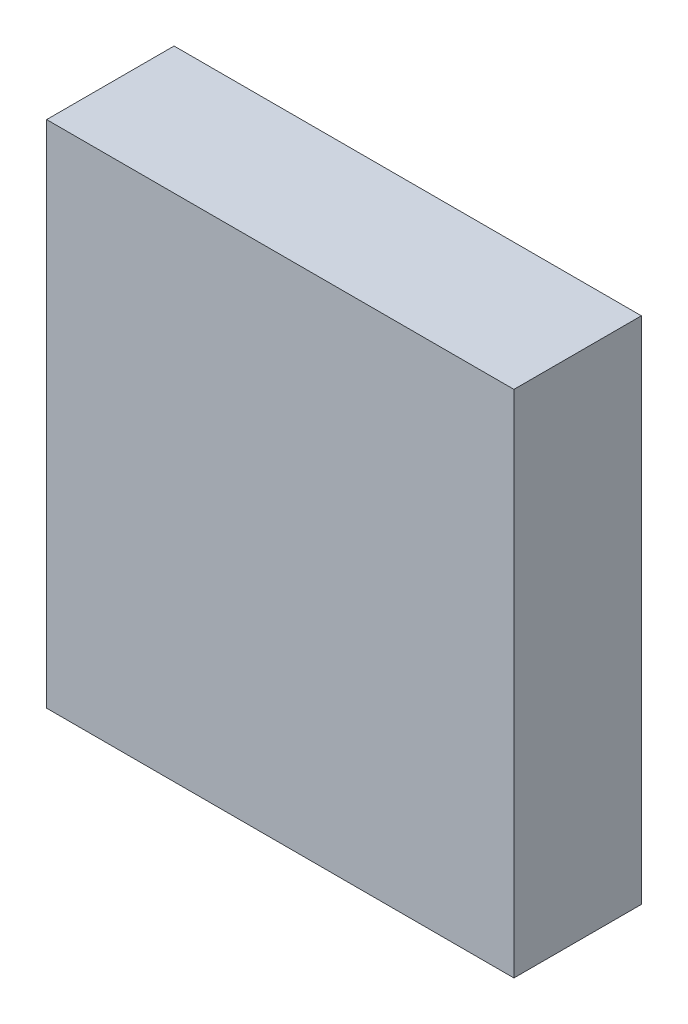
ISO-10303-21;
HEADER;
FILE_DESCRIPTION(('STEP AP214'),'2;1');
FILE_NAME('part.step','',(''),(''),'','','');
FILE_SCHEMA(('AUTOMOTIVE_DESIGN { 1 0 10303 214 1 1 1 1 }'));
ENDSEC;
DATA;
#1=APPLICATION_CONTEXT('core data for automotive mechanical design processes');
#2=APPLICATION_PROTOCOL_DEFINITION('international standard','automotive_design',2000,#1);
#3=PRODUCT_CONTEXT('',#1,'mechanical');
#4=PRODUCT('Part','Part','',(#3));
#5=PRODUCT_RELATED_PRODUCT_CATEGORY('part','',(#4));
#6=PRODUCT_DEFINITION_FORMATION('','',#4);
#7=PRODUCT_DEFINITION_CONTEXT('part definition',#1,'design');
#8=PRODUCT_DEFINITION('design','',#6,#7);
#9=PRODUCT_DEFINITION_SHAPE('','',#8);
#10=(LENGTH_UNIT() NAMED_UNIT(*) SI_UNIT(.MILLI.,.METRE.));
#11=(NAMED_UNIT(*) PLANE_ANGLE_UNIT() SI_UNIT($,.RADIAN.));
#12=(NAMED_UNIT(*) SI_UNIT($,.STERADIAN.) SOLID_ANGLE_UNIT());
#13=UNCERTAINTY_MEASURE_WITH_UNIT(LENGTH_MEASURE(1.E-05),#10,'distance_accuracy_value','');
#14=(GEOMETRIC_REPRESENTATION_CONTEXT(3) GLOBAL_UNCERTAINTY_ASSIGNED_CONTEXT((#13)) GLOBAL_UNIT_ASSIGNED_CONTEXT((#10,
#11,#12)) REPRESENTATION_CONTEXT('',''));
#15=CARTESIAN_POINT('',(0.,0.,0.));
#16=DIRECTION('',(0.,0.,1.));
#17=DIRECTION('',(1.,0.,0.));
#18=AXIS2_PLACEMENT_3D('',#15,#16,#17);
#19=CARTESIAN_POINT('',(5.5,-6.,3.));
#20=DIRECTION('',(-1.,0.,0.));
#21=DIRECTION('',(0.,0.,1.));
#22=AXIS2_PLACEMENT_3D('',#19,#20,#21);
#23=PLANE('',#22);
#24=DIRECTION('',(0.,1.,0.));
#25=VECTOR('',#24,1.);
#26=CARTESIAN_POINT('',(5.5,-6.,0.));
#27=LINE('',#26,#25);
#28=CARTESIAN_POINT('',(5.5,-6.,0.));
#29=VERTEX_POINT('',#28);
#30=CARTESIAN_POINT('',(5.5,6.,0.));
#31=VERTEX_POINT('',#30);
#32=EDGE_CURVE('E113',#29,#31,#27,.T.);
#33=ORIENTED_EDGE('',*,*,#32,.T.);
#34=DIRECTION('',(0.,0.,-1.));
#35=VECTOR('',#34,1.);
#36=CARTESIAN_POINT('',(5.5,6.,3.));
#37=LINE('',#36,#35);
#38=CARTESIAN_POINT('',(5.5,6.,3.));
#39=VERTEX_POINT('',#38);
#40=EDGE_CURVE('E11',#39,#31,#37,.T.);
#41=ORIENTED_EDGE('',*,*,#40,.F.);
#42=DIRECTION('',(0.,1.,0.));
#43=VECTOR('',#42,1.);
#44=CARTESIAN_POINT('',(5.5,-6.,3.));
#45=LINE('',#44,#43);
#46=CARTESIAN_POINT('',(5.5,-6.,3.));
#47=VERTEX_POINT('',#46);
#48=EDGE_CURVE('E97',#47,#39,#45,.T.);
#49=ORIENTED_EDGE('',*,*,#48,.F.);
#50=DIRECTION('',(0.,0.,-1.));
#51=VECTOR('',#50,1.);
#52=CARTESIAN_POINT('',(5.5,-6.,3.));
#53=LINE('',#52,#51);
#54=EDGE_CURVE('E109',#47,#29,#53,.T.);
#55=ORIENTED_EDGE('',*,*,#54,.T.);
#56=EDGE_LOOP('',(#33,#41,#49,#55));
#57=FACE_BOUND('',#56,.T.);
#58=ADVANCED_FACE('F45',(#57),#23,.F.);
#59=CARTESIAN_POINT('',(-5.5,6.,3.));
#60=DIRECTION('',(0.,-1.,0.));
#61=DIRECTION('',(0.,0.,-1.));
#62=AXIS2_PLACEMENT_3D('',#59,#60,#61);
#63=PLANE('',#62);
#64=DIRECTION('',(-1.,0.,0.));
#65=VECTOR('',#64,1.);
#66=CARTESIAN_POINT('',(-5.5,6.,0.));
#67=LINE('',#66,#65);
#68=CARTESIAN_POINT('',(-5.5,6.,0.));
#69=VERTEX_POINT('',#68);
#70=EDGE_CURVE('E102',#31,#69,#67,.T.);
#71=ORIENTED_EDGE('',*,*,#70,.T.);
#72=DIRECTION('',(0.,0.,-1.));
#73=VECTOR('',#72,1.);
#74=CARTESIAN_POINT('',(-5.5,6.,3.));
#75=LINE('',#74,#73);
#76=CARTESIAN_POINT('',(-5.5,6.,3.));
#77=VERTEX_POINT('',#76);
#78=EDGE_CURVE('E54',#77,#69,#75,.T.);
#79=ORIENTED_EDGE('',*,*,#78,.F.);
#80=DIRECTION('',(-1.,0.,0.));
#81=VECTOR('',#80,1.);
#82=CARTESIAN_POINT('',(-5.5,6.,3.));
#83=LINE('',#82,#81);
#84=EDGE_CURVE('E92',#39,#77,#83,.T.);
#85=ORIENTED_EDGE('',*,*,#84,.F.);
#86=ORIENTED_EDGE('',*,*,#40,.T.);
#87=EDGE_LOOP('',(#71,#79,#85,#86));
#88=FACE_BOUND('',#87,.T.);
#89=ADVANCED_FACE('F101',(#88),#63,.F.);
#90=CARTESIAN_POINT('',(-5.5,-6.,3.));
#91=DIRECTION('',(1.,0.,0.));
#92=DIRECTION('',(0.,0.,-1.));
#93=AXIS2_PLACEMENT_3D('',#90,#91,#92);
#94=PLANE('',#93);
#95=DIRECTION('',(0.,-1.,0.));
#96=VECTOR('',#95,1.);
#97=CARTESIAN_POINT('',(-5.5,-6.,0.));
#98=LINE('',#97,#96);
#99=CARTESIAN_POINT('',(-5.5,-6.,0.));
#100=VERTEX_POINT('',#99);
#101=EDGE_CURVE('E79',#69,#100,#98,.T.);
#102=ORIENTED_EDGE('',*,*,#101,.T.);
#103=DIRECTION('',(0.,0.,-1.));
#104=VECTOR('',#103,1.);
#105=CARTESIAN_POINT('',(-5.5,-6.,3.));
#106=LINE('',#105,#104);
#107=CARTESIAN_POINT('',(-5.5,-6.,3.));
#108=VERTEX_POINT('',#107);
#109=EDGE_CURVE('E104',#108,#100,#106,.T.);
#110=ORIENTED_EDGE('',*,*,#109,.F.);
#111=DIRECTION('',(0.,-1.,0.));
#112=VECTOR('',#111,1.);
#113=CARTESIAN_POINT('',(-5.5,-6.,3.));
#114=LINE('',#113,#112);
#115=EDGE_CURVE('E95',#77,#108,#114,.T.);
#116=ORIENTED_EDGE('',*,*,#115,.F.);
#117=ORIENTED_EDGE('',*,*,#78,.T.);
#118=EDGE_LOOP('',(#102,#110,#116,#117));
#119=FACE_BOUND('',#118,.T.);
#120=ADVANCED_FACE('F105',(#119),#94,.F.);
#121=CARTESIAN_POINT('',(-5.5,-6.,3.));
#122=DIRECTION('',(0.,1.,0.));
#123=DIRECTION('',(0.,0.,1.));
#124=AXIS2_PLACEMENT_3D('',#121,#122,#123);
#125=PLANE('',#124);
#126=DIRECTION('',(1.,0.,0.));
#127=VECTOR('',#126,1.);
#128=CARTESIAN_POINT('',(-5.5,-6.,0.));
#129=LINE('',#128,#127);
#130=EDGE_CURVE('E85',#100,#29,#129,.T.);
#131=ORIENTED_EDGE('',*,*,#130,.T.);
#132=ORIENTED_EDGE('',*,*,#54,.F.);
#133=DIRECTION('',(1.,0.,0.));
#134=VECTOR('',#133,1.);
#135=CARTESIAN_POINT('',(-5.5,-6.,3.));
#136=LINE('',#135,#134);
#137=EDGE_CURVE('E62',#108,#47,#136,.T.);
#138=ORIENTED_EDGE('',*,*,#137,.F.);
#139=ORIENTED_EDGE('',*,*,#109,.T.);
#140=EDGE_LOOP('',(#131,#132,#138,#139));
#141=FACE_BOUND('',#140,.T.);
#142=ADVANCED_FACE('F126',(#141),#125,.F.);
#143=CARTESIAN_POINT('',(0.,0.,3.));
#144=DIRECTION('',(0.,0.,-1.));
#145=DIRECTION('',(-1.,0.,0.));
#146=AXIS2_PLACEMENT_3D('',#143,#144,#145);
#147=PLANE('',#146);
#148=ORIENTED_EDGE('',*,*,#48,.T.);
#149=ORIENTED_EDGE('',*,*,#84,.T.);
#150=ORIENTED_EDGE('',*,*,#115,.T.);
#151=ORIENTED_EDGE('',*,*,#137,.T.);
#152=EDGE_LOOP('',(#148,#149,#150,#151));
#153=FACE_BOUND('',#152,.T.);
#154=ADVANCED_FACE('F93',(#153),#147,.F.);
#155=CARTESIAN_POINT('',(0.,0.,0.));
#156=DIRECTION('',(0.,0.,-1.));
#157=DIRECTION('',(-1.,0.,0.));
#158=AXIS2_PLACEMENT_3D('',#155,#156,#157);
#159=PLANE('',#158);
#160=ORIENTED_EDGE('',*,*,#32,.F.);
#161=ORIENTED_EDGE('',*,*,#130,.F.);
#162=ORIENTED_EDGE('',*,*,#101,.F.);
#163=ORIENTED_EDGE('',*,*,#70,.F.);
#164=EDGE_LOOP('',(#160,#161,#162,#163));
#165=FACE_BOUND('',#164,.T.);
#166=ADVANCED_FACE('F129',(#165),#159,.T.);
#167=CLOSED_SHELL('',(#58,#89,#120,#142,#154,#166));
#168=MANIFOLD_SOLID_BREP('B2',#167);
#169=ADVANCED_BREP_SHAPE_REPRESENTATION('',(#18,#168),#14);
#170=SHAPE_DEFINITION_REPRESENTATION(#9,#169);
ENDSEC;
END-ISO-10303-21;
